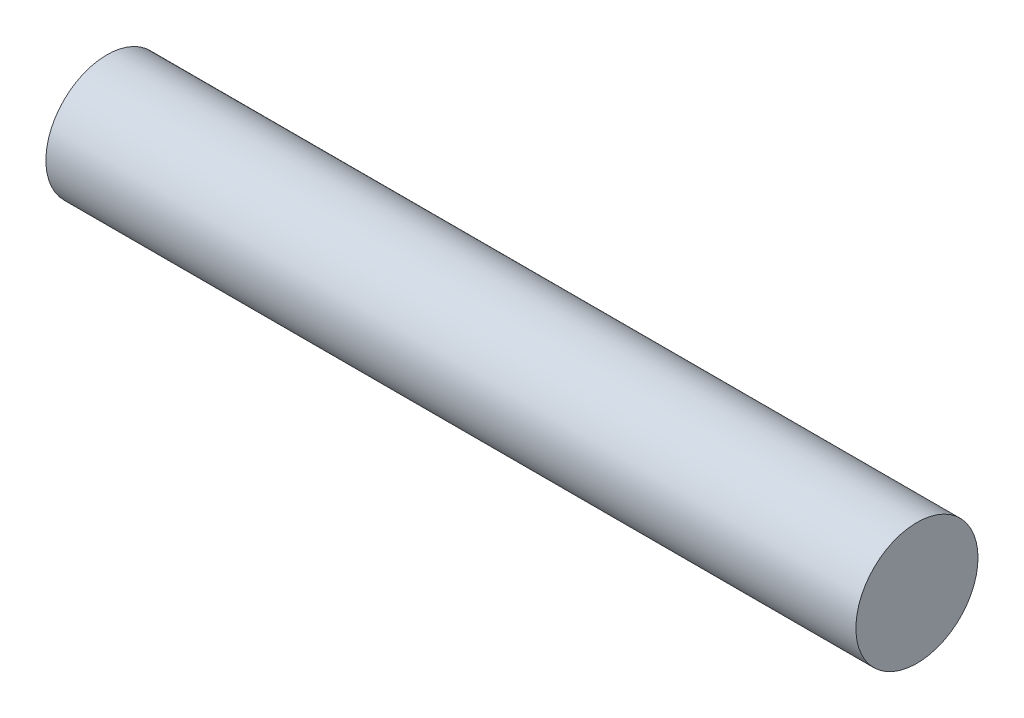
ISO-10303-21;
HEADER;
FILE_DESCRIPTION(('STEP AP214'),'2;1');
FILE_NAME('part.step','',(''),(''),'','','');
FILE_SCHEMA(('AUTOMOTIVE_DESIGN { 1 0 10303 214 1 1 1 1 }'));
ENDSEC;
DATA;
#1=APPLICATION_CONTEXT('core data for automotive mechanical design processes');
#2=APPLICATION_PROTOCOL_DEFINITION('international standard','automotive_design',2000,#1);
#3=PRODUCT_CONTEXT('',#1,'mechanical');
#4=PRODUCT('Part','Part','',(#3));
#5=PRODUCT_RELATED_PRODUCT_CATEGORY('part','',(#4));
#6=PRODUCT_DEFINITION_FORMATION('','',#4);
#7=PRODUCT_DEFINITION_CONTEXT('part definition',#1,'design');
#8=PRODUCT_DEFINITION('design','',#6,#7);
#9=PRODUCT_DEFINITION_SHAPE('','',#8);
#10=(LENGTH_UNIT() NAMED_UNIT(*) SI_UNIT(.MILLI.,.METRE.));
#11=(NAMED_UNIT(*) PLANE_ANGLE_UNIT() SI_UNIT($,.RADIAN.));
#12=(NAMED_UNIT(*) SI_UNIT($,.STERADIAN.) SOLID_ANGLE_UNIT());
#13=UNCERTAINTY_MEASURE_WITH_UNIT(LENGTH_MEASURE(1.E-05),#10,'distance_accuracy_value','');
#14=(GEOMETRIC_REPRESENTATION_CONTEXT(3) GLOBAL_UNCERTAINTY_ASSIGNED_CONTEXT((#13)) GLOBAL_UNIT_ASSIGNED_CONTEXT((#10,
#11,#12)) REPRESENTATION_CONTEXT('',''));
#15=CARTESIAN_POINT('',(0.,0.,0.));
#16=DIRECTION('',(0.,0.,1.));
#17=DIRECTION('',(1.,0.,0.));
#18=AXIS2_PLACEMENT_3D('',#15,#16,#17);
#19=CARTESIAN_POINT('',(-9.73760262725779,0.,0.));
#20=DIRECTION('',(-1.,0.,0.));
#21=DIRECTION('',(0.,0.,1.));
#22=AXIS2_PLACEMENT_3D('',#19,#20,#21);
#23=PLANE('',#22);
#24=CARTESIAN_POINT('',(-9.73760262725779,0.,0.));
#25=DIRECTION('',(1.,0.,0.));
#26=DIRECTION('',(0.,0.,-1.));
#27=AXIS2_PLACEMENT_3D('',#24,#25,#26);
#28=CIRCLE('',#27,1.5);
#29=CARTESIAN_POINT('',(-9.73760262725779,0.,-1.5));
#30=VERTEX_POINT('',#29);
#31=EDGE_CURVE('E10',#30,#30,#28,.T.);
#32=ORIENTED_EDGE('',*,*,#31,.F.);
#33=EDGE_LOOP('',(#32));
#34=FACE_BOUND('',#33,.T.);
#35=ADVANCED_FACE('F37',(#34),#23,.T.);
#36=CARTESIAN_POINT('',(10.9466338259442,0.,0.));
#37=DIRECTION('',(1.,0.,0.));
#38=DIRECTION('',(0.,0.,-1.));
#39=AXIS2_PLACEMENT_3D('',#36,#37,#38);
#40=CYLINDRICAL_SURFACE('',#39,1.5);
#41=ORIENTED_EDGE('',*,*,#31,.T.);
#42=EDGE_LOOP('',(#41));
#43=FACE_BOUND('',#42,.T.);
#44=CARTESIAN_POINT('',(10.1623973727422,0.,0.));
#45=DIRECTION('',(1.,0.,0.));
#46=DIRECTION('',(0.,0.,-1.));
#47=AXIS2_PLACEMENT_3D('',#44,#45,#46);
#48=CIRCLE('',#47,1.5);
#49=CARTESIAN_POINT('',(10.1623973727422,0.,-1.5));
#50=VERTEX_POINT('',#49);
#51=EDGE_CURVE('E43',#50,#50,#48,.T.);
#52=ORIENTED_EDGE('',*,*,#51,.F.);
#53=EDGE_LOOP('',(#52));
#54=FACE_BOUND('',#53,.T.);
#55=ADVANCED_FACE('F51',(#43,#54),#40,.T.);
#56=CARTESIAN_POINT('',(10.1623973727422,1.5,0.));
#57=DIRECTION('',(1.,0.,0.));
#58=DIRECTION('',(0.,0.,-1.));
#59=AXIS2_PLACEMENT_3D('',#56,#57,#58);
#60=PLANE('',#59);
#61=ORIENTED_EDGE('',*,*,#51,.T.);
#62=EDGE_LOOP('',(#61));
#63=FACE_BOUND('',#62,.T.);
#64=ADVANCED_FACE('F49',(#63),#60,.T.);
#65=CLOSED_SHELL('',(#35,#55,#64));
#66=MANIFOLD_SOLID_BREP('B2',#65);
#67=ADVANCED_BREP_SHAPE_REPRESENTATION('',(#18,#66),#14);
#68=SHAPE_DEFINITION_REPRESENTATION(#9,#67);
ENDSEC;
END-ISO-10303-21;
